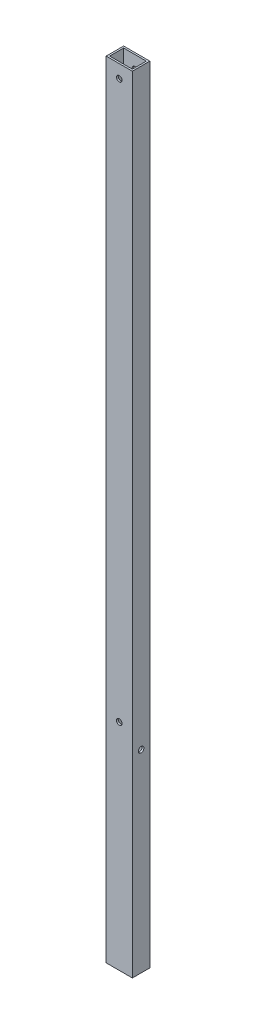
ISO-10303-21;
HEADER;
FILE_DESCRIPTION(('STEP AP214'),'2;1');
FILE_NAME('part.step','',(''),(''),'','','');
FILE_SCHEMA(('AUTOMOTIVE_DESIGN { 1 0 10303 214 1 1 1 1 }'));
ENDSEC;
DATA;
#1=APPLICATION_CONTEXT('core data for automotive mechanical design processes');
#2=APPLICATION_PROTOCOL_DEFINITION('international standard','automotive_design',2000,#1);
#3=PRODUCT_CONTEXT('',#1,'mechanical');
#4=PRODUCT('Part','Part','',(#3));
#5=PRODUCT_RELATED_PRODUCT_CATEGORY('part','',(#4));
#6=PRODUCT_DEFINITION_FORMATION('','',#4);
#7=PRODUCT_DEFINITION_CONTEXT('part definition',#1,'design');
#8=PRODUCT_DEFINITION('design','',#6,#7);
#9=PRODUCT_DEFINITION_SHAPE('','',#8);
#10=(LENGTH_UNIT() NAMED_UNIT(*) SI_UNIT(.MILLI.,.METRE.));
#11=(NAMED_UNIT(*) PLANE_ANGLE_UNIT() SI_UNIT($,.RADIAN.));
#12=(NAMED_UNIT(*) SI_UNIT($,.STERADIAN.) SOLID_ANGLE_UNIT());
#13=UNCERTAINTY_MEASURE_WITH_UNIT(LENGTH_MEASURE(1.E-05),#10,'distance_accuracy_value','');
#14=(GEOMETRIC_REPRESENTATION_CONTEXT(3) GLOBAL_UNCERTAINTY_ASSIGNED_CONTEXT((#13)) GLOBAL_UNIT_ASSIGNED_CONTEXT((#10,
#11,#12)) REPRESENTATION_CONTEXT('',''));
#15=CARTESIAN_POINT('',(0.,0.,0.));
#16=DIRECTION('',(0.,0.,1.));
#17=DIRECTION('',(1.,0.,0.));
#18=AXIS2_PLACEMENT_3D('',#15,#16,#17);
#19=CARTESIAN_POINT('',(-7.50000000000003,468.458242536085,454.498723906995));
#20=DIRECTION('',(0.,0.,1.));
#21=DIRECTION('',(1.,0.,0.));
#22=AXIS2_PLACEMENT_3D('',#19,#20,#21);
#23=CYLINDRICAL_SURFACE('',#22,1.59999999998277);
#24=CARTESIAN_POINT('',(-7.50000000000003,468.458242536085,455.498723906995));
#25=DIRECTION('',(0.,0.,-1.));
#26=DIRECTION('',(-1.,0.,0.));
#27=AXIS2_PLACEMENT_3D('',#24,#25,#26);
#28=CIRCLE('',#27,1.59999999998277);
#29=CARTESIAN_POINT('',(-9.0999999999828,468.458242536085,455.498723906995));
#30=VERTEX_POINT('',#29);
#31=EDGE_CURVE('E142',#30,#30,#28,.F.);
#32=ORIENTED_EDGE('',*,*,#31,.T.);
#33=EDGE_LOOP('',(#32));
#34=FACE_BOUND('',#33,.T.);
#35=CARTESIAN_POINT('',(-7.50000000000003,468.458242536085,454.498723906995));
#36=DIRECTION('',(0.,0.,1.));
#37=DIRECTION('',(1.,0.,0.));
#38=AXIS2_PLACEMENT_3D('',#35,#36,#37);
#39=CIRCLE('',#38,1.59999999998277);
#40=CARTESIAN_POINT('',(-5.90000000001726,468.458242536085,454.498723906995));
#41=VERTEX_POINT('',#40);
#42=EDGE_CURVE('E167',#41,#41,#39,.T.);
#43=ORIENTED_EDGE('',*,*,#42,.F.);
#44=EDGE_LOOP('',(#43));
#45=FACE_BOUND('',#44,.T.);
#46=ADVANCED_FACE('F33',(#34,#45),#23,.F.);
#47=CARTESIAN_POINT('',(-7.49999999999905,149.274909627903,454.498723906995));
#48=DIRECTION('',(0.,0.,1.));
#49=DIRECTION('',(1.,0.,0.));
#50=AXIS2_PLACEMENT_3D('',#47,#48,#49);
#51=CYLINDRICAL_SURFACE('',#50,1.59999999998274);
#52=CARTESIAN_POINT('',(-7.49999999999905,149.274909627903,455.498723906995));
#53=DIRECTION('',(0.,0.,-1.));
#54=DIRECTION('',(-1.,0.,0.));
#55=AXIS2_PLACEMENT_3D('',#52,#53,#54);
#56=CIRCLE('',#55,1.59999999998274);
#57=CARTESIAN_POINT('',(-9.09999999998179,149.274909627903,455.498723906995));
#58=VERTEX_POINT('',#57);
#59=EDGE_CURVE('E139',#58,#58,#56,.F.);
#60=ORIENTED_EDGE('',*,*,#59,.T.);
#61=EDGE_LOOP('',(#60));
#62=FACE_BOUND('',#61,.T.);
#63=CARTESIAN_POINT('',(-7.49999999999905,149.274909627903,454.498723906995));
#64=DIRECTION('',(0.,0.,1.));
#65=DIRECTION('',(1.,0.,0.));
#66=AXIS2_PLACEMENT_3D('',#63,#64,#65);
#67=CIRCLE('',#66,1.59999999998274);
#68=CARTESIAN_POINT('',(-5.90000000001631,149.274909627903,454.498723906995));
#69=VERTEX_POINT('',#68);
#70=EDGE_CURVE('E161',#69,#69,#67,.T.);
#71=ORIENTED_EDGE('',*,*,#70,.F.);
#72=EDGE_LOOP('',(#71));
#73=FACE_BOUND('',#72,.T.);
#74=ADVANCED_FACE('F212',(#62,#73),#51,.F.);
#75=CARTESIAN_POINT('',(0.,136.774909627903,459.498723906995));
#76=DIRECTION('',(-1.,0.,0.));
#77=DIRECTION('',(0.,-1.,0.));
#78=AXIS2_PLACEMENT_3D('',#75,#76,#77);
#79=CYLINDRICAL_SURFACE('',#78,1.59999999999996);
#80=CARTESIAN_POINT('',(-14.,136.774909627903,459.498723906995));
#81=DIRECTION('',(-1.,0.,0.));
#82=DIRECTION('',(0.,0.,1.));
#83=AXIS2_PLACEMENT_3D('',#80,#81,#82);
#84=CIRCLE('',#83,1.59999999999996);
#85=CARTESIAN_POINT('',(-14.,136.774909627903,461.098723906995));
#86=VERTEX_POINT('',#85);
#87=EDGE_CURVE('E129',#86,#86,#84,.F.);
#88=ORIENTED_EDGE('',*,*,#87,.T.);
#89=EDGE_LOOP('',(#88));
#90=FACE_BOUND('',#89,.T.);
#91=CARTESIAN_POINT('',(-14.9999999999999,136.774909627903,459.498723906995));
#92=DIRECTION('',(-1.,0.,0.));
#93=DIRECTION('',(0.,-1.,0.));
#94=AXIS2_PLACEMENT_3D('',#91,#92,#93);
#95=CIRCLE('',#94,1.59999999999996);
#96=CARTESIAN_POINT('',(-14.9999999999999,135.174909627903,459.498723906995));
#97=VERTEX_POINT('',#96);
#98=EDGE_CURVE('E145',#97,#97,#95,.T.);
#99=ORIENTED_EDGE('',*,*,#98,.T.);
#100=EDGE_LOOP('',(#99));
#101=FACE_BOUND('',#100,.T.);
#102=ADVANCED_FACE('F240',(#90,#101),#79,.F.);
#103=CARTESIAN_POINT('',(-14.9999999999999,0.,454.498723906995));
#104=DIRECTION('',(-1.,0.,0.));
#105=DIRECTION('',(0.,-1.,0.));
#106=AXIS2_PLACEMENT_3D('',#103,#104,#105);
#107=PLANE('',#106);
#108=ORIENTED_EDGE('',*,*,#98,.F.);
#109=EDGE_LOOP('',(#108));
#110=FACE_BOUND('',#109,.T.);
#111=DIRECTION('',(0.,0.,1.));
#112=VECTOR('',#111,1.);
#113=CARTESIAN_POINT('',(-15.,25.9582425360851,364.498723906995));
#114=LINE('',#113,#112);
#115=CARTESIAN_POINT('',(-15.,25.9582425360851,454.498723906995));
#116=VERTEX_POINT('',#115);
#117=CARTESIAN_POINT('',(-15.,25.9582425360851,464.498723906995));
#118=VERTEX_POINT('',#117);
#119=EDGE_CURVE('E154',#116,#118,#114,.T.);
#120=ORIENTED_EDGE('',*,*,#119,.T.);
#121=DIRECTION('',(0.,-1.,0.));
#122=VECTOR('',#121,1.);
#123=CARTESIAN_POINT('',(-14.9999999999999,0.,464.498723906995));
#124=LINE('',#123,#122);
#125=CARTESIAN_POINT('',(-15.,475.958242536085,464.498723906995));
#126=VERTEX_POINT('',#125);
#127=EDGE_CURVE('E170',#126,#118,#124,.T.);
#128=ORIENTED_EDGE('',*,*,#127,.F.);
#129=DIRECTION('',(0.,0.,1.));
#130=VECTOR('',#129,1.);
#131=CARTESIAN_POINT('',(-15.,475.958242536085,454.498723906995));
#132=LINE('',#131,#130);
#133=CARTESIAN_POINT('',(-15.,475.958242536085,454.498723906995));
#134=VERTEX_POINT('',#133);
#135=EDGE_CURVE('E189',#134,#126,#132,.T.);
#136=ORIENTED_EDGE('',*,*,#135,.F.);
#137=DIRECTION('',(0.,-1.,0.));
#138=VECTOR('',#137,1.);
#139=CARTESIAN_POINT('',(-14.9999999999999,0.,454.498723906995));
#140=LINE('',#139,#138);
#141=EDGE_CURVE('E173',#134,#116,#140,.T.);
#142=ORIENTED_EDGE('',*,*,#141,.T.);
#143=EDGE_LOOP('',(#120,#128,#136,#142));
#144=FACE_BOUND('',#143,.T.);
#145=ADVANCED_FACE('F35',(#110,#144),#107,.T.);
#146=CARTESIAN_POINT('',(-15.,475.958242536085,454.498723906995));
#147=DIRECTION('',(0.,1.,0.));
#148=DIRECTION('',(0.,0.,1.));
#149=AXIS2_PLACEMENT_3D('',#146,#147,#148);
#150=PLANE('',#149);
#151=DIRECTION('',(0.,0.,1.));
#152=VECTOR('',#151,1.);
#153=CARTESIAN_POINT('',(-14.,475.958242536085,455.498723906995));
#154=LINE('',#153,#152);
#155=CARTESIAN_POINT('',(-14.,475.958242536085,455.498723906995));
#156=VERTEX_POINT('',#155);
#157=CARTESIAN_POINT('',(-14.,475.958242536085,463.498723906995));
#158=VERTEX_POINT('',#157);
#159=EDGE_CURVE('E48',#156,#158,#154,.T.);
#160=ORIENTED_EDGE('',*,*,#159,.F.);
#161=DIRECTION('',(-1.,0.,0.));
#162=VECTOR('',#161,1.);
#163=CARTESIAN_POINT('',(-1.,475.958242536085,455.498723906995));
#164=LINE('',#163,#162);
#165=CARTESIAN_POINT('',(-1.,475.958242536085,455.498723906995));
#166=VERTEX_POINT('',#165);
#167=EDGE_CURVE('E118',#166,#156,#164,.T.);
#168=ORIENTED_EDGE('',*,*,#167,.F.);
#169=DIRECTION('',(0.,0.,-1.));
#170=VECTOR('',#169,1.);
#171=CARTESIAN_POINT('',(-1.,475.958242536085,463.498723906995));
#172=LINE('',#171,#170);
#173=CARTESIAN_POINT('',(-1.,475.958242536085,463.498723906995));
#174=VERTEX_POINT('',#173);
#175=EDGE_CURVE('E101',#174,#166,#172,.T.);
#176=ORIENTED_EDGE('',*,*,#175,.F.);
#177=DIRECTION('',(1.,0.,0.));
#178=VECTOR('',#177,1.);
#179=CARTESIAN_POINT('',(-14.,475.958242536085,463.498723906995));
#180=LINE('',#179,#178);
#181=EDGE_CURVE('E110',#158,#174,#180,.T.);
#182=ORIENTED_EDGE('',*,*,#181,.F.);
#183=EDGE_LOOP('',(#160,#168,#176,#182));
#184=FACE_BOUND('',#183,.T.);
#185=DIRECTION('',(-1.,0.,0.));
#186=VECTOR('',#185,1.);
#187=CARTESIAN_POINT('',(-15.,475.958242536085,464.498723906995));
#188=LINE('',#187,#186);
#189=CARTESIAN_POINT('',(0.,475.958242536085,464.498723906995));
#190=VERTEX_POINT('',#189);
#191=EDGE_CURVE('E177',#190,#126,#188,.T.);
#192=ORIENTED_EDGE('',*,*,#191,.F.);
#193=DIRECTION('',(0.,0.,1.));
#194=VECTOR('',#193,1.);
#195=CARTESIAN_POINT('',(0.,475.958242536085,454.498723906995));
#196=LINE('',#195,#194);
#197=CARTESIAN_POINT('',(0.,475.958242536085,454.498723906995));
#198=VERTEX_POINT('',#197);
#199=EDGE_CURVE('E182',#198,#190,#196,.T.);
#200=ORIENTED_EDGE('',*,*,#199,.F.);
#201=DIRECTION('',(-1.,0.,0.));
#202=VECTOR('',#201,1.);
#203=CARTESIAN_POINT('',(-15.,475.958242536085,454.498723906995));
#204=LINE('',#203,#202);
#205=EDGE_CURVE('E179',#198,#134,#204,.T.);
#206=ORIENTED_EDGE('',*,*,#205,.T.);
#207=ORIENTED_EDGE('',*,*,#135,.T.);
#208=EDGE_LOOP('',(#192,#200,#206,#207));
#209=FACE_BOUND('',#208,.T.);
#210=ADVANCED_FACE('F115',(#184,#209),#150,.T.);
#211=CARTESIAN_POINT('',(0.,475.958242536085,454.498723906995));
#212=DIRECTION('',(1.,0.,0.));
#213=DIRECTION('',(0.,1.,0.));
#214=AXIS2_PLACEMENT_3D('',#211,#212,#213);
#215=PLANE('',#214);
#216=CARTESIAN_POINT('',(0.,136.774909627903,459.498723906995));
#217=DIRECTION('',(-1.,0.,0.));
#218=DIRECTION('',(0.,-1.,0.));
#219=AXIS2_PLACEMENT_3D('',#216,#217,#218);
#220=CIRCLE('',#219,1.59999999999996);
#221=CARTESIAN_POINT('',(0.,135.174909627903,459.498723906995));
#222=VERTEX_POINT('',#221);
#223=EDGE_CURVE('E146',#222,#222,#220,.T.);
#224=ORIENTED_EDGE('',*,*,#223,.T.);
#225=EDGE_LOOP('',(#224));
#226=FACE_BOUND('',#225,.T.);
#227=DIRECTION('',(0.,0.,1.));
#228=VECTOR('',#227,1.);
#229=CARTESIAN_POINT('',(0.,25.9582425360851,364.498723906995));
#230=LINE('',#229,#228);
#231=CARTESIAN_POINT('',(0.,25.9582425360851,454.498723906995));
#232=VERTEX_POINT('',#231);
#233=CARTESIAN_POINT('',(0.,25.9582425360851,464.498723906995));
#234=VERTEX_POINT('',#233);
#235=EDGE_CURVE('E153',#232,#234,#230,.T.);
#236=ORIENTED_EDGE('',*,*,#235,.F.);
#237=DIRECTION('',(0.,1.,0.));
#238=VECTOR('',#237,1.);
#239=CARTESIAN_POINT('',(0.,475.958242536085,454.498723906995));
#240=LINE('',#239,#238);
#241=EDGE_CURVE('E176',#232,#198,#240,.T.);
#242=ORIENTED_EDGE('',*,*,#241,.T.);
#243=ORIENTED_EDGE('',*,*,#199,.T.);
#244=DIRECTION('',(0.,1.,0.));
#245=VECTOR('',#244,1.);
#246=CARTESIAN_POINT('',(0.,475.958242536085,464.498723906995));
#247=LINE('',#246,#245);
#248=EDGE_CURVE('E185',#234,#190,#247,.T.);
#249=ORIENTED_EDGE('',*,*,#248,.F.);
#250=EDGE_LOOP('',(#236,#242,#243,#249));
#251=FACE_BOUND('',#250,.T.);
#252=ADVANCED_FACE('F220',(#226,#251),#215,.T.);
#253=CARTESIAN_POINT('',(0.,0.,454.498723906995));
#254=DIRECTION('',(0.,0.,-1.));
#255=DIRECTION('',(-1.,0.,0.));
#256=AXIS2_PLACEMENT_3D('',#253,#254,#255);
#257=PLANE('',#256);
#258=DIRECTION('',(1.,0.,0.));
#259=VECTOR('',#258,1.);
#260=CARTESIAN_POINT('',(0.,25.9582425360851,454.498723906995));
#261=LINE('',#260,#259);
#262=EDGE_CURVE('E157',#116,#232,#261,.T.);
#263=ORIENTED_EDGE('',*,*,#262,.F.);
#264=ORIENTED_EDGE('',*,*,#141,.F.);
#265=ORIENTED_EDGE('',*,*,#205,.F.);
#266=ORIENTED_EDGE('',*,*,#241,.F.);
#267=EDGE_LOOP('',(#263,#264,#265,#266));
#268=FACE_BOUND('',#267,.T.);
#269=ORIENTED_EDGE('',*,*,#70,.T.);
#270=EDGE_LOOP('',(#269));
#271=FACE_BOUND('',#270,.T.);
#272=ORIENTED_EDGE('',*,*,#42,.T.);
#273=EDGE_LOOP('',(#272));
#274=FACE_BOUND('',#273,.T.);
#275=ADVANCED_FACE('F217',(#268,#271,#274),#257,.T.);
#276=CARTESIAN_POINT('',(0.,0.,464.498723906995));
#277=DIRECTION('',(0.,0.,-1.));
#278=DIRECTION('',(-1.,0.,0.));
#279=AXIS2_PLACEMENT_3D('',#276,#277,#278);
#280=PLANE('',#279);
#281=CARTESIAN_POINT('',(-7.49999999999905,149.274909627903,464.498723906995));
#282=DIRECTION('',(0.,0.,1.));
#283=DIRECTION('',(1.,0.,0.));
#284=AXIS2_PLACEMENT_3D('',#281,#282,#283);
#285=CIRCLE('',#284,1.59999999998274);
#286=CARTESIAN_POINT('',(-5.90000000001631,149.274909627903,464.498723906995));
#287=VERTEX_POINT('',#286);
#288=EDGE_CURVE('E160',#287,#287,#285,.T.);
#289=ORIENTED_EDGE('',*,*,#288,.F.);
#290=EDGE_LOOP('',(#289));
#291=FACE_BOUND('',#290,.T.);
#292=CARTESIAN_POINT('',(-7.50000000000003,468.458242536085,464.498723906995));
#293=DIRECTION('',(0.,0.,1.));
#294=DIRECTION('',(1.,0.,0.));
#295=AXIS2_PLACEMENT_3D('',#292,#293,#294);
#296=CIRCLE('',#295,1.59999999998277);
#297=CARTESIAN_POINT('',(-5.90000000001726,468.458242536085,464.498723906995));
#298=VERTEX_POINT('',#297);
#299=EDGE_CURVE('E164',#298,#298,#296,.T.);
#300=ORIENTED_EDGE('',*,*,#299,.F.);
#301=EDGE_LOOP('',(#300));
#302=FACE_BOUND('',#301,.T.);
#303=ORIENTED_EDGE('',*,*,#127,.T.);
#304=DIRECTION('',(-1.,0.,0.));
#305=VECTOR('',#304,1.);
#306=CARTESIAN_POINT('',(0.,25.9582425360851,464.498723906995));
#307=LINE('',#306,#305);
#308=EDGE_CURVE('E149',#234,#118,#307,.T.);
#309=ORIENTED_EDGE('',*,*,#308,.F.);
#310=ORIENTED_EDGE('',*,*,#248,.T.);
#311=ORIENTED_EDGE('',*,*,#191,.T.);
#312=EDGE_LOOP('',(#303,#309,#310,#311));
#313=FACE_BOUND('',#312,.T.);
#314=ADVANCED_FACE('F219',(#291,#302,#313),#280,.F.);
#315=CARTESIAN_POINT('',(-7.50000000000003,468.458242536085,463.498723906995));
#316=DIRECTION('',(0.,0.,1.));
#317=DIRECTION('',(1.,0.,0.));
#318=AXIS2_PLACEMENT_3D('',#315,#316,#317);
#319=CIRCLE('',#318,1.59999999998277);
#320=CARTESIAN_POINT('',(-5.90000000001726,468.458242536085,463.498723906995));
#321=VERTEX_POINT('',#320);
#322=EDGE_CURVE('E136',#321,#321,#319,.F.);
#323=ORIENTED_EDGE('',*,*,#322,.T.);
#324=EDGE_LOOP('',(#323));
#325=FACE_BOUND('',#324,.T.);
#326=ORIENTED_EDGE('',*,*,#299,.T.);
#327=EDGE_LOOP('',(#326));
#328=FACE_BOUND('',#327,.T.);
#329=ADVANCED_FACE('F214',(#325,#328),#23,.F.);
#330=CARTESIAN_POINT('',(-7.49999999999905,149.274909627903,463.498723906995));
#331=DIRECTION('',(0.,0.,1.));
#332=DIRECTION('',(1.,0.,0.));
#333=AXIS2_PLACEMENT_3D('',#330,#331,#332);
#334=CIRCLE('',#333,1.59999999998274);
#335=CARTESIAN_POINT('',(-5.90000000001631,149.274909627903,463.498723906995));
#336=VERTEX_POINT('',#335);
#337=EDGE_CURVE('E133',#336,#336,#334,.F.);
#338=ORIENTED_EDGE('',*,*,#337,.T.);
#339=EDGE_LOOP('',(#338));
#340=FACE_BOUND('',#339,.T.);
#341=ORIENTED_EDGE('',*,*,#288,.T.);
#342=EDGE_LOOP('',(#341));
#343=FACE_BOUND('',#342,.T.);
#344=ADVANCED_FACE('F260',(#340,#343),#51,.F.);
#345=CARTESIAN_POINT('',(0.,25.9582425360851,364.498723906995));
#346=DIRECTION('',(0.,1.,0.));
#347=DIRECTION('',(0.,0.,1.));
#348=AXIS2_PLACEMENT_3D('',#345,#346,#347);
#349=PLANE('',#348);
#350=DIRECTION('',(-1.,0.,0.));
#351=VECTOR('',#350,1.);
#352=CARTESIAN_POINT('',(0.,25.9582425360851,455.498723906995));
#353=LINE('',#352,#351);
#354=CARTESIAN_POINT('',(-1.,25.9582425360851,455.498723906995));
#355=VERTEX_POINT('',#354);
#356=CARTESIAN_POINT('',(-14.,25.9582425360851,455.498723906995));
#357=VERTEX_POINT('',#356);
#358=EDGE_CURVE('E11',#355,#357,#353,.T.);
#359=ORIENTED_EDGE('',*,*,#358,.T.);
#360=DIRECTION('',(0.,0.,1.));
#361=VECTOR('',#360,1.);
#362=CARTESIAN_POINT('',(-14.,25.9582425360851,364.498723906995));
#363=LINE('',#362,#361);
#364=CARTESIAN_POINT('',(-14.,25.9582425360851,463.498723906995));
#365=VERTEX_POINT('',#364);
#366=EDGE_CURVE('E130',#357,#365,#363,.T.);
#367=ORIENTED_EDGE('',*,*,#366,.T.);
#368=DIRECTION('',(1.,0.,0.));
#369=VECTOR('',#368,1.);
#370=CARTESIAN_POINT('',(0.,25.9582425360851,463.498723906995));
#371=LINE('',#370,#369);
#372=CARTESIAN_POINT('',(-1.,25.9582425360851,463.498723906995));
#373=VERTEX_POINT('',#372);
#374=EDGE_CURVE('E41',#365,#373,#371,.T.);
#375=ORIENTED_EDGE('',*,*,#374,.T.);
#376=DIRECTION('',(0.,0.,-1.));
#377=VECTOR('',#376,1.);
#378=CARTESIAN_POINT('',(-1.,25.9582425360851,364.498723906995));
#379=LINE('',#378,#377);
#380=EDGE_CURVE('E104',#373,#355,#379,.T.);
#381=ORIENTED_EDGE('',*,*,#380,.T.);
#382=EDGE_LOOP('',(#359,#367,#375,#381));
#383=FACE_BOUND('',#382,.T.);
#384=ORIENTED_EDGE('',*,*,#262,.T.);
#385=ORIENTED_EDGE('',*,*,#235,.T.);
#386=ORIENTED_EDGE('',*,*,#308,.T.);
#387=ORIENTED_EDGE('',*,*,#119,.F.);
#388=EDGE_LOOP('',(#384,#385,#386,#387));
#389=FACE_BOUND('',#388,.T.);
#390=ADVANCED_FACE('F197',(#383,#389),#349,.F.);
#391=CARTESIAN_POINT('',(-1.,136.774909627903,459.498723906995));
#392=DIRECTION('',(1.,0.,0.));
#393=DIRECTION('',(0.,0.,-1.));
#394=AXIS2_PLACEMENT_3D('',#391,#392,#393);
#395=CIRCLE('',#394,1.59999999999996);
#396=CARTESIAN_POINT('',(-1.,136.774909627903,457.898723906995));
#397=VERTEX_POINT('',#396);
#398=EDGE_CURVE('E125',#397,#397,#395,.F.);
#399=ORIENTED_EDGE('',*,*,#398,.T.);
#400=EDGE_LOOP('',(#399));
#401=FACE_BOUND('',#400,.T.);
#402=ORIENTED_EDGE('',*,*,#223,.F.);
#403=EDGE_LOOP('',(#402));
#404=FACE_BOUND('',#403,.T.);
#405=ADVANCED_FACE('F205',(#401,#404),#79,.F.);
#406=CARTESIAN_POINT('',(-1.,-524.041757463915,455.498723906995));
#407=DIRECTION('',(0.,0.,-1.));
#408=DIRECTION('',(-1.,0.,0.));
#409=AXIS2_PLACEMENT_3D('',#406,#407,#408);
#410=PLANE('',#409);
#411=ORIENTED_EDGE('',*,*,#59,.F.);
#412=EDGE_LOOP('',(#411));
#413=FACE_BOUND('',#412,.T.);
#414=DIRECTION('',(0.,1.,0.));
#415=VECTOR('',#414,1.);
#416=CARTESIAN_POINT('',(-1.,-524.041757463915,455.498723906995));
#417=LINE('',#416,#415);
#418=EDGE_CURVE('E106',#355,#166,#417,.T.);
#419=ORIENTED_EDGE('',*,*,#418,.T.);
#420=ORIENTED_EDGE('',*,*,#167,.T.);
#421=DIRECTION('',(0.,1.,0.));
#422=VECTOR('',#421,1.);
#423=CARTESIAN_POINT('',(-14.,-524.041757463915,455.498723906995));
#424=LINE('',#423,#422);
#425=EDGE_CURVE('E123',#357,#156,#424,.T.);
#426=ORIENTED_EDGE('',*,*,#425,.F.);
#427=ORIENTED_EDGE('',*,*,#358,.F.);
#428=EDGE_LOOP('',(#419,#420,#426,#427));
#429=FACE_BOUND('',#428,.T.);
#430=ORIENTED_EDGE('',*,*,#31,.F.);
#431=EDGE_LOOP('',(#430));
#432=FACE_BOUND('',#431,.T.);
#433=ADVANCED_FACE('F202',(#413,#429,#432),#410,.F.);
#434=CARTESIAN_POINT('',(-14.,-524.041757463915,463.498723906995));
#435=DIRECTION('',(0.,0.,1.));
#436=DIRECTION('',(1.,0.,0.));
#437=AXIS2_PLACEMENT_3D('',#434,#435,#436);
#438=PLANE('',#437);
#439=ORIENTED_EDGE('',*,*,#337,.F.);
#440=EDGE_LOOP('',(#439));
#441=FACE_BOUND('',#440,.T.);
#442=DIRECTION('',(0.,1.,0.));
#443=VECTOR('',#442,1.);
#444=CARTESIAN_POINT('',(-14.,-524.041757463915,463.498723906995));
#445=LINE('',#444,#443);
#446=EDGE_CURVE('E107',#365,#158,#445,.T.);
#447=ORIENTED_EDGE('',*,*,#446,.T.);
#448=ORIENTED_EDGE('',*,*,#181,.T.);
#449=DIRECTION('',(0.,1.,0.));
#450=VECTOR('',#449,1.);
#451=CARTESIAN_POINT('',(-1.,-524.041757463915,463.498723906995));
#452=LINE('',#451,#450);
#453=EDGE_CURVE('E56',#373,#174,#452,.T.);
#454=ORIENTED_EDGE('',*,*,#453,.F.);
#455=ORIENTED_EDGE('',*,*,#374,.F.);
#456=EDGE_LOOP('',(#447,#448,#454,#455));
#457=FACE_BOUND('',#456,.T.);
#458=ORIENTED_EDGE('',*,*,#322,.F.);
#459=EDGE_LOOP('',(#458));
#460=FACE_BOUND('',#459,.T.);
#461=ADVANCED_FACE('F111',(#441,#457,#460),#438,.F.);
#462=CARTESIAN_POINT('',(-14.,-524.041757463915,455.498723906995));
#463=DIRECTION('',(-1.,0.,0.));
#464=DIRECTION('',(0.,0.,1.));
#465=AXIS2_PLACEMENT_3D('',#462,#463,#464);
#466=PLANE('',#465);
#467=ORIENTED_EDGE('',*,*,#87,.F.);
#468=EDGE_LOOP('',(#467));
#469=FACE_BOUND('',#468,.T.);
#470=ORIENTED_EDGE('',*,*,#425,.T.);
#471=ORIENTED_EDGE('',*,*,#159,.T.);
#472=ORIENTED_EDGE('',*,*,#446,.F.);
#473=ORIENTED_EDGE('',*,*,#366,.F.);
#474=EDGE_LOOP('',(#470,#471,#472,#473));
#475=FACE_BOUND('',#474,.T.);
#476=ADVANCED_FACE('F199',(#469,#475),#466,.F.);
#477=CARTESIAN_POINT('',(-1.,-524.041757463915,463.498723906995));
#478=DIRECTION('',(1.,0.,0.));
#479=DIRECTION('',(0.,0.,-1.));
#480=AXIS2_PLACEMENT_3D('',#477,#478,#479);
#481=PLANE('',#480);
#482=ORIENTED_EDGE('',*,*,#398,.F.);
#483=EDGE_LOOP('',(#482));
#484=FACE_BOUND('',#483,.T.);
#485=ORIENTED_EDGE('',*,*,#453,.T.);
#486=ORIENTED_EDGE('',*,*,#175,.T.);
#487=ORIENTED_EDGE('',*,*,#418,.F.);
#488=ORIENTED_EDGE('',*,*,#380,.F.);
#489=EDGE_LOOP('',(#485,#486,#487,#488));
#490=FACE_BOUND('',#489,.T.);
#491=ADVANCED_FACE('F98',(#484,#490),#481,.F.);
#492=CLOSED_SHELL('',(#46,#74,#102,#145,#210,#252,#275,#314,#329,#344,#390,#405,#433,#461,#476,#491));
#493=MANIFOLD_SOLID_BREP('B2',#492);
#494=ADVANCED_BREP_SHAPE_REPRESENTATION('',(#18,#493),#14);
#495=SHAPE_DEFINITION_REPRESENTATION(#9,#494);
ENDSEC;
END-ISO-10303-21;
